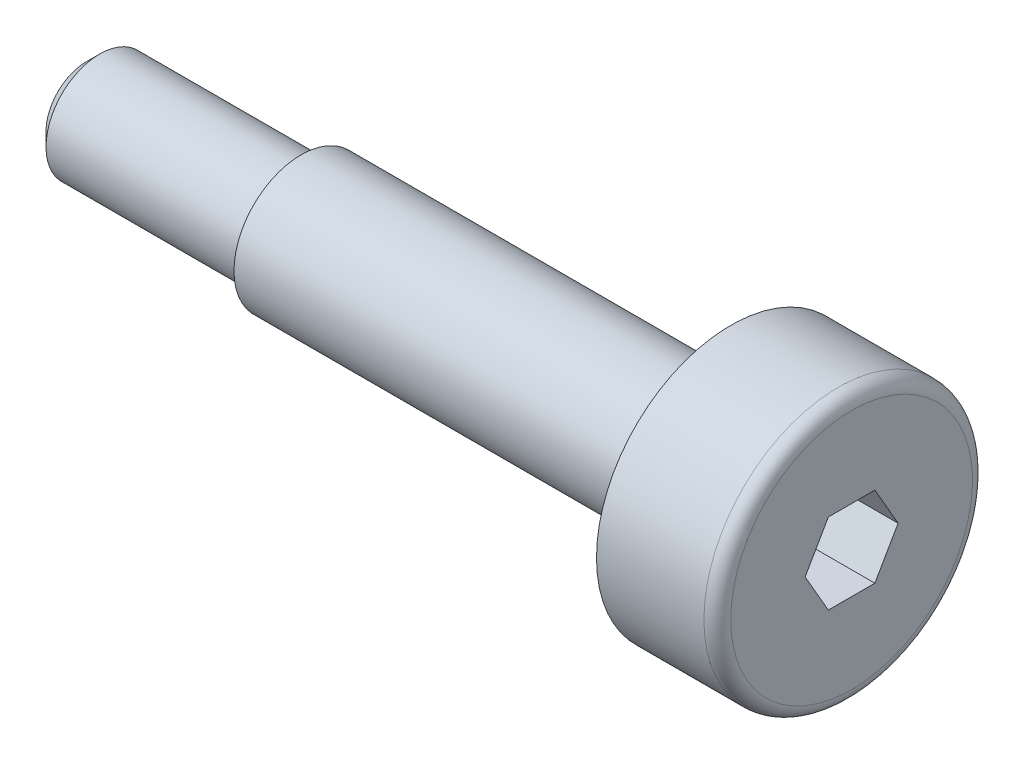
ISO-10303-21;
HEADER;
FILE_DESCRIPTION(('STEP AP214'),'2;1');
FILE_NAME('part.step','',(''),(''),'','','');
FILE_SCHEMA(('AUTOMOTIVE_DESIGN { 1 0 10303 214 1 1 1 1 }'));
ENDSEC;
DATA;
#1=APPLICATION_CONTEXT('core data for automotive mechanical design processes');
#2=APPLICATION_PROTOCOL_DEFINITION('international standard','automotive_design',2000,#1);
#3=PRODUCT_CONTEXT('',#1,'mechanical');
#4=PRODUCT('Part','Part','',(#3));
#5=PRODUCT_RELATED_PRODUCT_CATEGORY('part','',(#4));
#6=PRODUCT_DEFINITION_FORMATION('','',#4);
#7=PRODUCT_DEFINITION_CONTEXT('part definition',#1,'design');
#8=PRODUCT_DEFINITION('design','',#6,#7);
#9=PRODUCT_DEFINITION_SHAPE('','',#8);
#10=(LENGTH_UNIT() NAMED_UNIT(*) SI_UNIT(.MILLI.,.METRE.));
#11=(NAMED_UNIT(*) PLANE_ANGLE_UNIT() SI_UNIT($,.RADIAN.));
#12=(NAMED_UNIT(*) SI_UNIT($,.STERADIAN.) SOLID_ANGLE_UNIT());
#13=UNCERTAINTY_MEASURE_WITH_UNIT(LENGTH_MEASURE(1.E-05),#10,'distance_accuracy_value','');
#14=(GEOMETRIC_REPRESENTATION_CONTEXT(3) GLOBAL_UNCERTAINTY_ASSIGNED_CONTEXT((#13)) GLOBAL_UNIT_ASSIGNED_CONTEXT((#10,
#11,#12)) REPRESENTATION_CONTEXT('',''));
#15=CARTESIAN_POINT('',(0.,0.,0.));
#16=DIRECTION('',(0.,0.,1.));
#17=DIRECTION('',(1.,0.,0.));
#18=AXIS2_PLACEMENT_3D('',#15,#16,#17);
#19=CARTESIAN_POINT('',(0.,0.,0.));
#20=DIRECTION('',(-1.,0.,0.));
#21=DIRECTION('',(0.,0.,1.));
#22=AXIS2_PLACEMENT_3D('',#19,#20,#21);
#23=PLANE('',#22);
#24=DIRECTION('',(0.,0.866025403784439,0.5));
#25=VECTOR('',#24,1.);
#26=CARTESIAN_POINT('',(0.,0.,-1.73205080756888));
#27=LINE('',#26,#25);
#28=CARTESIAN_POINT('',(0.,0.,-1.73205080756888));
#29=VERTEX_POINT('',#28);
#30=CARTESIAN_POINT('',(0.,1.5,-0.866025403784438));
#31=VERTEX_POINT('',#30);
#32=EDGE_CURVE('E137',#29,#31,#27,.T.);
#33=ORIENTED_EDGE('',*,*,#32,.F.);
#34=DIRECTION('',(0.,0.866025403784439,-0.5));
#35=VECTOR('',#34,1.);
#36=CARTESIAN_POINT('',(0.,-1.5,-0.866025403784439));
#37=LINE('',#36,#35);
#38=CARTESIAN_POINT('',(0.,-1.5,-0.866025403784439));
#39=VERTEX_POINT('',#38);
#40=EDGE_CURVE('E57',#39,#29,#37,.T.);
#41=ORIENTED_EDGE('',*,*,#40,.F.);
#42=DIRECTION('',(0.,0.,-1.));
#43=VECTOR('',#42,1.);
#44=CARTESIAN_POINT('',(0.,-1.5,0.866025403784438));
#45=LINE('',#44,#43);
#46=CARTESIAN_POINT('',(0.,-1.5,0.866025403784438));
#47=VERTEX_POINT('',#46);
#48=EDGE_CURVE('E150',#47,#39,#45,.T.);
#49=ORIENTED_EDGE('',*,*,#48,.F.);
#50=DIRECTION('',(0.,-0.866025403784439,-0.5));
#51=VECTOR('',#50,1.);
#52=CARTESIAN_POINT('',(0.,0.,1.73205080756888));
#53=LINE('',#52,#51);
#54=CARTESIAN_POINT('',(0.,0.,1.73205080756888));
#55=VERTEX_POINT('',#54);
#56=EDGE_CURVE('E147',#55,#47,#53,.T.);
#57=ORIENTED_EDGE('',*,*,#56,.F.);
#58=DIRECTION('',(0.,-0.866025403784439,0.5));
#59=VECTOR('',#58,1.);
#60=CARTESIAN_POINT('',(0.,1.5,0.866025403784439));
#61=LINE('',#60,#59);
#62=CARTESIAN_POINT('',(0.,1.5,0.866025403784439));
#63=VERTEX_POINT('',#62);
#64=EDGE_CURVE('E105',#63,#55,#61,.T.);
#65=ORIENTED_EDGE('',*,*,#64,.F.);
#66=DIRECTION('',(0.,0.,1.));
#67=VECTOR('',#66,1.);
#68=CARTESIAN_POINT('',(0.,1.5,-0.866025403784438));
#69=LINE('',#68,#67);
#70=EDGE_CURVE('E141',#31,#63,#69,.T.);
#71=ORIENTED_EDGE('',*,*,#70,.F.);
#72=EDGE_LOOP('',(#33,#41,#49,#57,#65,#71));
#73=FACE_BOUND('',#72,.T.);
#74=CARTESIAN_POINT('',(0.,0.,0.));
#75=DIRECTION('',(-1.,0.,0.));
#76=DIRECTION('',(0.,0.,1.));
#77=AXIS2_PLACEMENT_3D('',#74,#75,#76);
#78=CIRCLE('',#77,4.5);
#79=CARTESIAN_POINT('',(0.,0.,4.5));
#80=VERTEX_POINT('',#79);
#81=EDGE_CURVE('E185',#80,#80,#78,.T.);
#82=ORIENTED_EDGE('',*,*,#81,.F.);
#83=EDGE_LOOP('',(#82));
#84=FACE_BOUND('',#83,.T.);
#85=ADVANCED_FACE('F41',(#73,#84),#23,.F.);
#86=CARTESIAN_POINT('',(-0.5,0.,0.));
#87=DIRECTION('',(-1.,0.,0.));
#88=DIRECTION('',(0.,0.,1.));
#89=AXIS2_PLACEMENT_3D('',#86,#87,#88);
#90=TOROIDAL_SURFACE('',#89,4.5,0.499999999999999);
#91=CARTESIAN_POINT('',(-0.5,0.,0.));
#92=DIRECTION('',(-1.,0.,0.));
#93=DIRECTION('',(0.,0.,1.));
#94=AXIS2_PLACEMENT_3D('',#91,#92,#93);
#95=CIRCLE('',#94,5.);
#96=CARTESIAN_POINT('',(-0.5,0.,5.));
#97=VERTEX_POINT('',#96);
#98=EDGE_CURVE('E181',#97,#97,#95,.T.);
#99=ORIENTED_EDGE('',*,*,#98,.F.);
#100=EDGE_LOOP('',(#99));
#101=FACE_BOUND('',#100,.T.);
#102=ORIENTED_EDGE('',*,*,#81,.T.);
#103=EDGE_LOOP('',(#102));
#104=FACE_BOUND('',#103,.T.);
#105=ADVANCED_FACE('F207',(#101,#104),#90,.T.);
#106=CARTESIAN_POINT('',(0.,0.,0.));
#107=DIRECTION('',(-1.,0.,0.));
#108=DIRECTION('',(0.,0.,1.));
#109=AXIS2_PLACEMENT_3D('',#106,#107,#108);
#110=CYLINDRICAL_SURFACE('',#109,5.);
#111=CARTESIAN_POINT('',(-4.5,0.,0.));
#112=DIRECTION('',(-1.,0.,0.));
#113=DIRECTION('',(0.,0.,1.));
#114=AXIS2_PLACEMENT_3D('',#111,#112,#113);
#115=CIRCLE('',#114,5.);
#116=CARTESIAN_POINT('',(-4.5,0.,5.));
#117=VERTEX_POINT('',#116);
#118=EDGE_CURVE('E177',#117,#117,#115,.T.);
#119=ORIENTED_EDGE('',*,*,#118,.F.);
#120=EDGE_LOOP('',(#119));
#121=FACE_BOUND('',#120,.T.);
#122=ORIENTED_EDGE('',*,*,#98,.T.);
#123=EDGE_LOOP('',(#122));
#124=FACE_BOUND('',#123,.T.);
#125=ADVANCED_FACE('F212',(#121,#124),#110,.T.);
#126=CARTESIAN_POINT('',(-4.5,5.,0.));
#127=DIRECTION('',(1.,0.,0.));
#128=DIRECTION('',(0.,0.,-1.));
#129=AXIS2_PLACEMENT_3D('',#126,#127,#128);
#130=PLANE('',#129);
#131=CARTESIAN_POINT('',(-4.5,0.,0.));
#132=DIRECTION('',(-1.,0.,0.));
#133=DIRECTION('',(0.,0.,1.));
#134=AXIS2_PLACEMENT_3D('',#131,#132,#133);
#135=CIRCLE('',#134,2.5);
#136=CARTESIAN_POINT('',(-4.5,0.,2.5));
#137=VERTEX_POINT('',#136);
#138=EDGE_CURVE('E173',#137,#137,#135,.T.);
#139=ORIENTED_EDGE('',*,*,#138,.F.);
#140=EDGE_LOOP('',(#139));
#141=FACE_BOUND('',#140,.T.);
#142=ORIENTED_EDGE('',*,*,#118,.T.);
#143=EDGE_LOOP('',(#142));
#144=FACE_BOUND('',#143,.T.);
#145=ADVANCED_FACE('F220',(#141,#144),#130,.F.);
#146=CARTESIAN_POINT('',(0.,0.,0.));
#147=DIRECTION('',(-1.,0.,0.));
#148=DIRECTION('',(0.,0.,1.));
#149=AXIS2_PLACEMENT_3D('',#146,#147,#148);
#150=CYLINDRICAL_SURFACE('',#149,2.5);
#151=CARTESIAN_POINT('',(-20.5,0.,0.));
#152=DIRECTION('',(-1.,0.,0.));
#153=DIRECTION('',(0.,0.,1.));
#154=AXIS2_PLACEMENT_3D('',#151,#152,#153);
#155=CIRCLE('',#154,2.5);
#156=CARTESIAN_POINT('',(-20.5,0.,2.5));
#157=VERTEX_POINT('',#156);
#158=EDGE_CURVE('E169',#157,#157,#155,.T.);
#159=ORIENTED_EDGE('',*,*,#158,.F.);
#160=EDGE_LOOP('',(#159));
#161=FACE_BOUND('',#160,.T.);
#162=ORIENTED_EDGE('',*,*,#138,.T.);
#163=EDGE_LOOP('',(#162));
#164=FACE_BOUND('',#163,.T.);
#165=ADVANCED_FACE('F224',(#161,#164),#150,.T.);
#166=CARTESIAN_POINT('',(-20.5,2.5,0.));
#167=DIRECTION('',(1.,0.,0.));
#168=DIRECTION('',(0.,0.,-1.));
#169=AXIS2_PLACEMENT_3D('',#166,#167,#168);
#170=PLANE('',#169);
#171=CARTESIAN_POINT('',(-20.5,0.,0.));
#172=DIRECTION('',(-1.,0.,0.));
#173=DIRECTION('',(0.,0.,1.));
#174=AXIS2_PLACEMENT_3D('',#171,#172,#173);
#175=CIRCLE('',#174,2.);
#176=CARTESIAN_POINT('',(-20.5,0.,2.));
#177=VERTEX_POINT('',#176);
#178=EDGE_CURVE('E156',#177,#177,#175,.T.);
#179=ORIENTED_EDGE('',*,*,#178,.F.);
#180=EDGE_LOOP('',(#179));
#181=FACE_BOUND('',#180,.T.);
#182=ORIENTED_EDGE('',*,*,#158,.T.);
#183=EDGE_LOOP('',(#182));
#184=FACE_BOUND('',#183,.T.);
#185=ADVANCED_FACE('F228',(#181,#184),#170,.F.);
#186=CARTESIAN_POINT('',(0.,0.,0.));
#187=DIRECTION('',(-1.,0.,0.));
#188=DIRECTION('',(0.,0.,1.));
#189=AXIS2_PLACEMENT_3D('',#186,#187,#188);
#190=CYLINDRICAL_SURFACE('',#189,2.);
#191=CARTESIAN_POINT('',(-28.,0.,0.));
#192=DIRECTION('',(1.,0.,0.));
#193=DIRECTION('',(0.,0.,-1.));
#194=AXIS2_PLACEMENT_3D('',#191,#192,#193);
#195=CIRCLE('',#194,2.);
#196=CARTESIAN_POINT('',(-28.,0.,-2.));
#197=VERTEX_POINT('',#196);
#198=EDGE_CURVE('E11',#197,#197,#195,.T.);
#199=ORIENTED_EDGE('',*,*,#198,.T.);
#200=EDGE_LOOP('',(#199));
#201=FACE_BOUND('',#200,.T.);
#202=ORIENTED_EDGE('',*,*,#178,.T.);
#203=EDGE_LOOP('',(#202));
#204=FACE_BOUND('',#203,.T.);
#205=ADVANCED_FACE('F203',(#201,#204),#190,.T.);
#206=CARTESIAN_POINT('',(-28.5,2.,0.));
#207=DIRECTION('',(1.,0.,0.));
#208=DIRECTION('',(0.,0.,-1.));
#209=AXIS2_PLACEMENT_3D('',#206,#207,#208);
#210=PLANE('',#209);
#211=CARTESIAN_POINT('',(-28.5,0.,0.));
#212=DIRECTION('',(1.,0.,0.));
#213=DIRECTION('',(0.,0.,-1.));
#214=AXIS2_PLACEMENT_3D('',#211,#212,#213);
#215=CIRCLE('',#214,1.5);
#216=CARTESIAN_POINT('',(-28.5,0.,-1.5));
#217=VERTEX_POINT('',#216);
#218=EDGE_CURVE('E50',#217,#217,#215,.F.);
#219=ORIENTED_EDGE('',*,*,#218,.T.);
#220=EDGE_LOOP('',(#219));
#221=FACE_BOUND('',#220,.T.);
#222=ADVANCED_FACE('F192',(#221),#210,.F.);
#223=CARTESIAN_POINT('',(-28.5,0.,0.));
#224=DIRECTION('',(1.,0.,0.));
#225=DIRECTION('',(0.,0.,-1.));
#226=AXIS2_PLACEMENT_3D('',#223,#224,#225);
#227=CONICAL_SURFACE('',#226,1.5,0.785398163397448);
#228=ORIENTED_EDGE('',*,*,#198,.F.);
#229=EDGE_LOOP('',(#228));
#230=FACE_BOUND('',#229,.T.);
#231=ORIENTED_EDGE('',*,*,#218,.F.);
#232=EDGE_LOOP('',(#231));
#233=FACE_BOUND('',#232,.T.);
#234=ADVANCED_FACE('F43',(#230,#233),#227,.T.);
#235=CARTESIAN_POINT('',(-2.4,-1.5,-0.866025403784439));
#236=DIRECTION('',(0.,-0.5,-0.866025403784439));
#237=DIRECTION('',(0.,0.866025403784439,-0.5));
#238=AXIS2_PLACEMENT_3D('',#235,#236,#237);
#239=PLANE('',#238);
#240=ORIENTED_EDGE('',*,*,#40,.T.);
#241=DIRECTION('',(1.,0.,0.));
#242=VECTOR('',#241,1.);
#243=CARTESIAN_POINT('',(-2.4,0.,-1.73205080756888));
#244=LINE('',#243,#242);
#245=CARTESIAN_POINT('',(-2.4,0.,-1.73205080756888));
#246=VERTEX_POINT('',#245);
#247=EDGE_CURVE('E87',#246,#29,#244,.T.);
#248=ORIENTED_EDGE('',*,*,#247,.F.);
#249=DIRECTION('',(0.,0.866025403784439,-0.5));
#250=VECTOR('',#249,1.);
#251=CARTESIAN_POINT('',(-2.4,-1.5,-0.866025403784439));
#252=LINE('',#251,#250);
#253=CARTESIAN_POINT('',(-2.4,-1.5,-0.866025403784439));
#254=VERTEX_POINT('',#253);
#255=EDGE_CURVE('E153',#254,#246,#252,.T.);
#256=ORIENTED_EDGE('',*,*,#255,.F.);
#257=DIRECTION('',(1.,0.,0.));
#258=VECTOR('',#257,1.);
#259=CARTESIAN_POINT('',(-2.4,-1.5,-0.866025403784439));
#260=LINE('',#259,#258);
#261=EDGE_CURVE('E65',#254,#39,#260,.T.);
#262=ORIENTED_EDGE('',*,*,#261,.T.);
#263=EDGE_LOOP('',(#240,#248,#256,#262));
#264=FACE_BOUND('',#263,.T.);
#265=ADVANCED_FACE('F195',(#264),#239,.F.);
#266=CARTESIAN_POINT('',(-2.4,-1.5,0.866025403784438));
#267=DIRECTION('',(0.,-1.,0.));
#268=DIRECTION('',(0.,0.,-1.));
#269=AXIS2_PLACEMENT_3D('',#266,#267,#268);
#270=PLANE('',#269);
#271=ORIENTED_EDGE('',*,*,#48,.T.);
#272=ORIENTED_EDGE('',*,*,#261,.F.);
#273=DIRECTION('',(0.,0.,-1.));
#274=VECTOR('',#273,1.);
#275=CARTESIAN_POINT('',(-2.4,-1.5,0.866025403784438));
#276=LINE('',#275,#274);
#277=CARTESIAN_POINT('',(-2.4,-1.5,0.866025403784438));
#278=VERTEX_POINT('',#277);
#279=EDGE_CURVE('E119',#278,#254,#276,.T.);
#280=ORIENTED_EDGE('',*,*,#279,.F.);
#281=DIRECTION('',(1.,0.,0.));
#282=VECTOR('',#281,1.);
#283=CARTESIAN_POINT('',(-2.4,-1.5,0.866025403784438));
#284=LINE('',#283,#282);
#285=EDGE_CURVE('E110',#278,#47,#284,.T.);
#286=ORIENTED_EDGE('',*,*,#285,.T.);
#287=EDGE_LOOP('',(#271,#272,#280,#286));
#288=FACE_BOUND('',#287,.T.);
#289=ADVANCED_FACE('F201',(#288),#270,.F.);
#290=CARTESIAN_POINT('',(-2.4,0.,1.73205080756888));
#291=DIRECTION('',(0.,-0.5,0.866025403784439));
#292=DIRECTION('',(0.,-0.866025403784439,-0.5));
#293=AXIS2_PLACEMENT_3D('',#290,#291,#292);
#294=PLANE('',#293);
#295=ORIENTED_EDGE('',*,*,#56,.T.);
#296=ORIENTED_EDGE('',*,*,#285,.F.);
#297=DIRECTION('',(0.,-0.866025403784439,-0.5));
#298=VECTOR('',#297,1.);
#299=CARTESIAN_POINT('',(-2.4,0.,1.73205080756888));
#300=LINE('',#299,#298);
#301=CARTESIAN_POINT('',(-2.4,0.,1.73205080756888));
#302=VERTEX_POINT('',#301);
#303=EDGE_CURVE('E114',#302,#278,#300,.T.);
#304=ORIENTED_EDGE('',*,*,#303,.F.);
#305=DIRECTION('',(1.,0.,0.));
#306=VECTOR('',#305,1.);
#307=CARTESIAN_POINT('',(-2.4,0.,1.73205080756888));
#308=LINE('',#307,#306);
#309=EDGE_CURVE('E98',#302,#55,#308,.T.);
#310=ORIENTED_EDGE('',*,*,#309,.T.);
#311=EDGE_LOOP('',(#295,#296,#304,#310));
#312=FACE_BOUND('',#311,.T.);
#313=ADVANCED_FACE('F115',(#312),#294,.F.);
#314=CARTESIAN_POINT('',(-2.4,1.5,0.866025403784439));
#315=DIRECTION('',(0.,0.5,0.866025403784439));
#316=DIRECTION('',(0.,-0.866025403784439,0.5));
#317=AXIS2_PLACEMENT_3D('',#314,#315,#316);
#318=PLANE('',#317);
#319=ORIENTED_EDGE('',*,*,#64,.T.);
#320=ORIENTED_EDGE('',*,*,#309,.F.);
#321=DIRECTION('',(0.,-0.866025403784439,0.5));
#322=VECTOR('',#321,1.);
#323=CARTESIAN_POINT('',(-2.4,1.5,0.866025403784439));
#324=LINE('',#323,#322);
#325=CARTESIAN_POINT('',(-2.4,1.5,0.866025403784439));
#326=VERTEX_POINT('',#325);
#327=EDGE_CURVE('E102',#326,#302,#324,.T.);
#328=ORIENTED_EDGE('',*,*,#327,.F.);
#329=DIRECTION('',(1.,0.,0.));
#330=VECTOR('',#329,1.);
#331=CARTESIAN_POINT('',(-2.4,1.5,0.866025403784439));
#332=LINE('',#331,#330);
#333=EDGE_CURVE('E111',#326,#63,#332,.T.);
#334=ORIENTED_EDGE('',*,*,#333,.T.);
#335=EDGE_LOOP('',(#319,#320,#328,#334));
#336=FACE_BOUND('',#335,.T.);
#337=ADVANCED_FACE('F100',(#336),#318,.F.);
#338=CARTESIAN_POINT('',(-2.4,1.5,-0.866025403784438));
#339=DIRECTION('',(0.,1.,0.));
#340=DIRECTION('',(0.,0.,1.));
#341=AXIS2_PLACEMENT_3D('',#338,#339,#340);
#342=PLANE('',#341);
#343=ORIENTED_EDGE('',*,*,#70,.T.);
#344=ORIENTED_EDGE('',*,*,#333,.F.);
#345=DIRECTION('',(0.,0.,1.));
#346=VECTOR('',#345,1.);
#347=CARTESIAN_POINT('',(-2.4,1.5,-0.866025403784438));
#348=LINE('',#347,#346);
#349=CARTESIAN_POINT('',(-2.4,1.5,-0.866025403784438));
#350=VERTEX_POINT('',#349);
#351=EDGE_CURVE('E125',#350,#326,#348,.T.);
#352=ORIENTED_EDGE('',*,*,#351,.F.);
#353=DIRECTION('',(1.,0.,0.));
#354=VECTOR('',#353,1.);
#355=CARTESIAN_POINT('',(-2.4,1.5,-0.866025403784438));
#356=LINE('',#355,#354);
#357=EDGE_CURVE('E161',#350,#31,#356,.T.);
#358=ORIENTED_EDGE('',*,*,#357,.T.);
#359=EDGE_LOOP('',(#343,#344,#352,#358));
#360=FACE_BOUND('',#359,.T.);
#361=ADVANCED_FACE('F239',(#360),#342,.F.);
#362=CARTESIAN_POINT('',(-2.4,0.,-1.73205080756888));
#363=DIRECTION('',(0.,0.5,-0.866025403784438));
#364=DIRECTION('',(0.,0.866025403784439,0.5));
#365=AXIS2_PLACEMENT_3D('',#362,#363,#364);
#366=PLANE('',#365);
#367=ORIENTED_EDGE('',*,*,#32,.T.);
#368=ORIENTED_EDGE('',*,*,#357,.F.);
#369=DIRECTION('',(0.,0.866025403784439,0.5));
#370=VECTOR('',#369,1.);
#371=CARTESIAN_POINT('',(-2.4,0.,-1.73205080756888));
#372=LINE('',#371,#370);
#373=EDGE_CURVE('E129',#246,#350,#372,.T.);
#374=ORIENTED_EDGE('',*,*,#373,.F.);
#375=ORIENTED_EDGE('',*,*,#247,.T.);
#376=EDGE_LOOP('',(#367,#368,#374,#375));
#377=FACE_BOUND('',#376,.T.);
#378=ADVANCED_FACE('F236',(#377),#366,.F.);
#379=CARTESIAN_POINT('',(-2.4,0.,0.));
#380=DIRECTION('',(1.,0.,0.));
#381=DIRECTION('',(0.,0.,-1.));
#382=AXIS2_PLACEMENT_3D('',#379,#380,#381);
#383=PLANE('',#382);
#384=ORIENTED_EDGE('',*,*,#255,.T.);
#385=ORIENTED_EDGE('',*,*,#373,.T.);
#386=ORIENTED_EDGE('',*,*,#351,.T.);
#387=ORIENTED_EDGE('',*,*,#327,.T.);
#388=ORIENTED_EDGE('',*,*,#303,.T.);
#389=ORIENTED_EDGE('',*,*,#279,.T.);
#390=EDGE_LOOP('',(#384,#385,#386,#387,#388,#389));
#391=FACE_BOUND('',#390,.T.);
#392=ADVANCED_FACE('F122',(#391),#383,.T.);
#393=CLOSED_SHELL('',(#85,#105,#125,#145,#165,#185,#205,#222,#234,#265,#289,#313,#337,#361,#378,#392));
#394=MANIFOLD_SOLID_BREP('B2',#393);
#395=ADVANCED_BREP_SHAPE_REPRESENTATION('',(#18,#394),#14);
#396=SHAPE_DEFINITION_REPRESENTATION(#9,#395);
ENDSEC;
END-ISO-10303-21;
